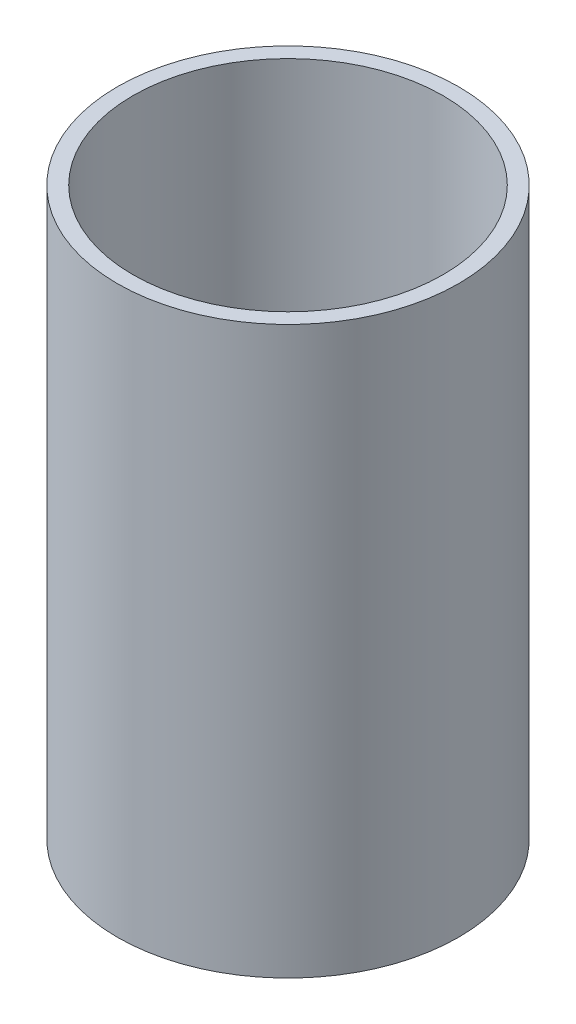
ISO-10303-21;
HEADER;
FILE_DESCRIPTION(('STEP AP214'),'2;1');
FILE_NAME('part.step','',(''),(''),'','','');
FILE_SCHEMA(('AUTOMOTIVE_DESIGN { 1 0 10303 214 1 1 1 1 }'));
ENDSEC;
DATA;
#1=APPLICATION_CONTEXT('core data for automotive mechanical design processes');
#2=APPLICATION_PROTOCOL_DEFINITION('international standard','automotive_design',2000,#1);
#3=PRODUCT_CONTEXT('',#1,'mechanical');
#4=PRODUCT('Part','Part','',(#3));
#5=PRODUCT_RELATED_PRODUCT_CATEGORY('part','',(#4));
#6=PRODUCT_DEFINITION_FORMATION('','',#4);
#7=PRODUCT_DEFINITION_CONTEXT('part definition',#1,'design');
#8=PRODUCT_DEFINITION('design','',#6,#7);
#9=PRODUCT_DEFINITION_SHAPE('','',#8);
#10=(LENGTH_UNIT() NAMED_UNIT(*) SI_UNIT(.MILLI.,.METRE.));
#11=(NAMED_UNIT(*) PLANE_ANGLE_UNIT() SI_UNIT($,.RADIAN.));
#12=(NAMED_UNIT(*) SI_UNIT($,.STERADIAN.) SOLID_ANGLE_UNIT());
#13=UNCERTAINTY_MEASURE_WITH_UNIT(LENGTH_MEASURE(1.E-05),#10,'distance_accuracy_value','');
#14=(GEOMETRIC_REPRESENTATION_CONTEXT(3) GLOBAL_UNCERTAINTY_ASSIGNED_CONTEXT((#13)) GLOBAL_UNIT_ASSIGNED_CONTEXT((#10,
#11,#12)) REPRESENTATION_CONTEXT('',''));
#15=CARTESIAN_POINT('',(0.,0.,0.));
#16=DIRECTION('',(0.,0.,1.));
#17=DIRECTION('',(1.,0.,0.));
#18=AXIS2_PLACEMENT_3D('',#15,#16,#17);
#19=CARTESIAN_POINT('',(0.,73.,0.));
#20=DIRECTION('',(0.,1.,0.));
#21=DIRECTION('',(0.,0.,1.));
#22=AXIS2_PLACEMENT_3D('',#19,#20,#21);
#23=PLANE('',#22);
#24=CARTESIAN_POINT('',(0.,73.,0.));
#25=DIRECTION('',(0.,1.,0.));
#26=DIRECTION('',(0.,0.,1.));
#27=AXIS2_PLACEMENT_3D('',#24,#25,#26);
#28=CIRCLE('',#27,22.);
#29=CARTESIAN_POINT('',(0.,73.,22.));
#30=VERTEX_POINT('',#29);
#31=EDGE_CURVE('E10',#30,#30,#28,.T.);
#32=ORIENTED_EDGE('',*,*,#31,.T.);
#33=EDGE_LOOP('',(#32));
#34=FACE_BOUND('',#33,.T.);
#35=CARTESIAN_POINT('',(0.,73.,0.));
#36=DIRECTION('',(0.,1.,0.));
#37=DIRECTION('',(0.,0.,1.));
#38=AXIS2_PLACEMENT_3D('',#35,#36,#37);
#39=CIRCLE('',#38,20.);
#40=CARTESIAN_POINT('',(0.,73.,20.));
#41=VERTEX_POINT('',#40);
#42=EDGE_CURVE('E46',#41,#41,#39,.T.);
#43=ORIENTED_EDGE('',*,*,#42,.F.);
#44=EDGE_LOOP('',(#43));
#45=FACE_BOUND('',#44,.T.);
#46=ADVANCED_FACE('F35',(#34,#45),#23,.T.);
#47=CARTESIAN_POINT('',(0.,0.,0.));
#48=DIRECTION('',(0.,1.,0.));
#49=DIRECTION('',(0.,0.,1.));
#50=AXIS2_PLACEMENT_3D('',#47,#48,#49);
#51=PLANE('',#50);
#52=CARTESIAN_POINT('',(0.,0.,0.));
#53=DIRECTION('',(0.,1.,0.));
#54=DIRECTION('',(0.,0.,1.));
#55=AXIS2_PLACEMENT_3D('',#52,#53,#54);
#56=CIRCLE('',#55,22.);
#57=CARTESIAN_POINT('',(0.,0.,22.));
#58=VERTEX_POINT('',#57);
#59=EDGE_CURVE('E39',#58,#58,#56,.T.);
#60=ORIENTED_EDGE('',*,*,#59,.F.);
#61=EDGE_LOOP('',(#60));
#62=FACE_BOUND('',#61,.T.);
#63=CARTESIAN_POINT('',(0.,0.,0.));
#64=DIRECTION('',(0.,1.,0.));
#65=DIRECTION('',(0.,0.,1.));
#66=AXIS2_PLACEMENT_3D('',#63,#64,#65);
#67=CIRCLE('',#66,20.);
#68=CARTESIAN_POINT('',(0.,0.,20.));
#69=VERTEX_POINT('',#68);
#70=EDGE_CURVE('E48',#69,#69,#67,.T.);
#71=ORIENTED_EDGE('',*,*,#70,.T.);
#72=EDGE_LOOP('',(#71));
#73=FACE_BOUND('',#72,.T.);
#74=ADVANCED_FACE('F58',(#62,#73),#51,.F.);
#75=CARTESIAN_POINT('',(0.,73.,0.));
#76=DIRECTION('',(0.,-1.,0.));
#77=DIRECTION('',(0.,0.,-1.));
#78=AXIS2_PLACEMENT_3D('',#75,#76,#77);
#79=CYLINDRICAL_SURFACE('',#78,22.);
#80=ORIENTED_EDGE('',*,*,#31,.F.);
#81=EDGE_LOOP('',(#80));
#82=FACE_BOUND('',#81,.T.);
#83=ORIENTED_EDGE('',*,*,#59,.T.);
#84=EDGE_LOOP('',(#83));
#85=FACE_BOUND('',#84,.T.);
#86=ADVANCED_FACE('F37',(#82,#85),#79,.T.);
#87=CARTESIAN_POINT('',(0.,73.,0.));
#88=DIRECTION('',(0.,-1.,0.));
#89=DIRECTION('',(0.,0.,-1.));
#90=AXIS2_PLACEMENT_3D('',#87,#88,#89);
#91=CYLINDRICAL_SURFACE('',#90,20.);
#92=ORIENTED_EDGE('',*,*,#42,.T.);
#93=EDGE_LOOP('',(#92));
#94=FACE_BOUND('',#93,.T.);
#95=ORIENTED_EDGE('',*,*,#70,.F.);
#96=EDGE_LOOP('',(#95));
#97=FACE_BOUND('',#96,.T.);
#98=ADVANCED_FACE('F54',(#94,#97),#91,.F.);
#99=CLOSED_SHELL('',(#46,#74,#86,#98));
#100=MANIFOLD_SOLID_BREP('B2',#99);
#101=ADVANCED_BREP_SHAPE_REPRESENTATION('',(#18,#100),#14);
#102=SHAPE_DEFINITION_REPRESENTATION(#9,#101);
ENDSEC;
END-ISO-10303-21;
